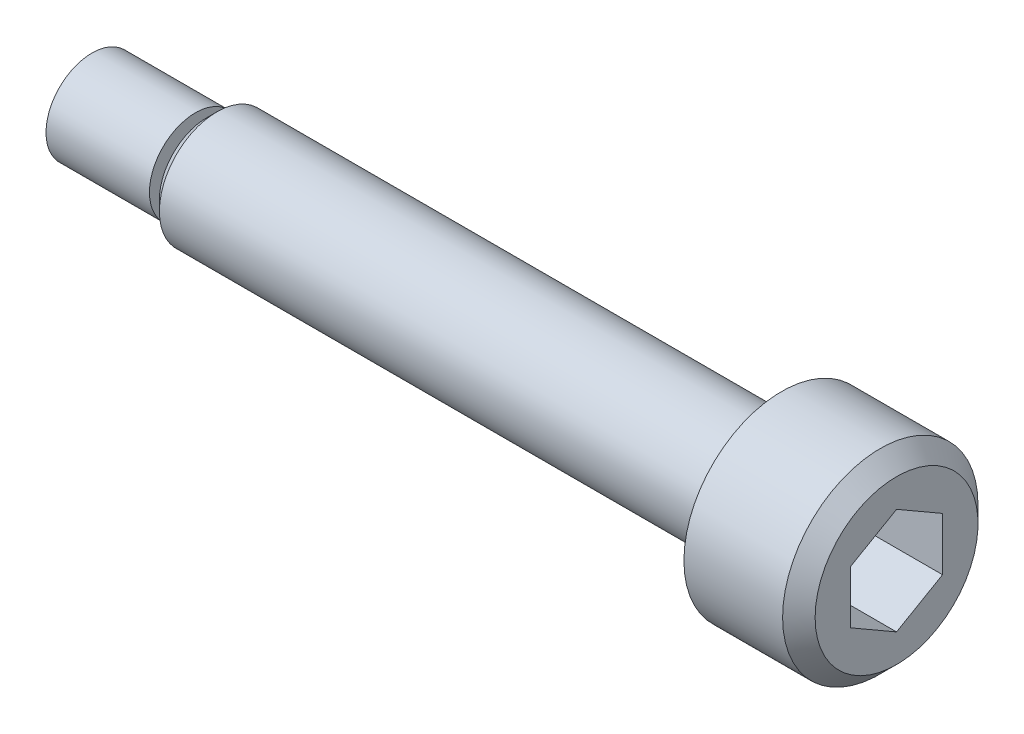
ISO-10303-21;
HEADER;
FILE_DESCRIPTION(('STEP AP214'),'2;1');
FILE_NAME('part.step','',(''),(''),'','','');
FILE_SCHEMA(('AUTOMOTIVE_DESIGN { 1 0 10303 214 1 1 1 1 }'));
ENDSEC;
DATA;
#1=APPLICATION_CONTEXT('core data for automotive mechanical design processes');
#2=APPLICATION_PROTOCOL_DEFINITION('international standard','automotive_design',2000,#1);
#3=PRODUCT_CONTEXT('',#1,'mechanical');
#4=PRODUCT('Part','Part','',(#3));
#5=PRODUCT_RELATED_PRODUCT_CATEGORY('part','',(#4));
#6=PRODUCT_DEFINITION_FORMATION('','',#4);
#7=PRODUCT_DEFINITION_CONTEXT('part definition',#1,'design');
#8=PRODUCT_DEFINITION('design','',#6,#7);
#9=PRODUCT_DEFINITION_SHAPE('','',#8);
#10=(LENGTH_UNIT() NAMED_UNIT(*) SI_UNIT(.MILLI.,.METRE.));
#11=(NAMED_UNIT(*) PLANE_ANGLE_UNIT() SI_UNIT($,.RADIAN.));
#12=(NAMED_UNIT(*) SI_UNIT($,.STERADIAN.) SOLID_ANGLE_UNIT());
#13=UNCERTAINTY_MEASURE_WITH_UNIT(LENGTH_MEASURE(1.E-05),#10,'distance_accuracy_value','');
#14=(GEOMETRIC_REPRESENTATION_CONTEXT(3) GLOBAL_UNCERTAINTY_ASSIGNED_CONTEXT((#13)) GLOBAL_UNIT_ASSIGNED_CONTEXT((#10,
#11,#12)) REPRESENTATION_CONTEXT('',''));
#15=CARTESIAN_POINT('',(0.,0.,0.));
#16=DIRECTION('',(0.,0.,1.));
#17=DIRECTION('',(1.,0.,0.));
#18=AXIS2_PLACEMENT_3D('',#15,#16,#17);
#19=CARTESIAN_POINT('',(30.,3.54289321881345,0.));
#20=DIRECTION('',(-1.,0.,0.));
#21=DIRECTION('',(0.,0.,1.));
#22=AXIS2_PLACEMENT_3D('',#19,#20,#21);
#23=PLANE('',#22);
#24=CARTESIAN_POINT('',(30.,0.,0.));
#25=DIRECTION('',(-1.,0.,0.));
#26=DIRECTION('',(0.,0.,1.));
#27=AXIS2_PLACEMENT_3D('',#24,#25,#26);
#28=CIRCLE('',#27,3.54289321881345);
#29=CARTESIAN_POINT('',(30.,0.,3.54289321881345));
#30=VERTEX_POINT('',#29);
#31=EDGE_CURVE('E177',#30,#30,#28,.T.);
#32=ORIENTED_EDGE('',*,*,#31,.F.);
#33=EDGE_LOOP('',(#32));
#34=FACE_BOUND('',#33,.T.);
#35=DIRECTION('',(0.,-1.,0.));
#36=VECTOR('',#35,1.);
#37=CARTESIAN_POINT('',(30.,1.15470053837925,2.));
#38=LINE('',#37,#36);
#39=CARTESIAN_POINT('',(30.,1.15470053837925,2.));
#40=VERTEX_POINT('',#39);
#41=CARTESIAN_POINT('',(30.,-1.15470053837925,2.));
#42=VERTEX_POINT('',#41);
#43=EDGE_CURVE('E152',#40,#42,#38,.T.);
#44=ORIENTED_EDGE('',*,*,#43,.F.);
#45=DIRECTION('',(0.,-0.5,0.866025403784439));
#46=VECTOR('',#45,1.);
#47=CARTESIAN_POINT('',(30.,2.3094010767585,0.));
#48=LINE('',#47,#46);
#49=CARTESIAN_POINT('',(30.,2.3094010767585,0.));
#50=VERTEX_POINT('',#49);
#51=EDGE_CURVE('E53',#50,#40,#48,.T.);
#52=ORIENTED_EDGE('',*,*,#51,.F.);
#53=DIRECTION('',(0.,0.5,0.866025403784439));
#54=VECTOR('',#53,1.);
#55=CARTESIAN_POINT('',(30.,1.15470053837925,-2.));
#56=LINE('',#55,#54);
#57=CARTESIAN_POINT('',(30.,1.15470053837925,-2.));
#58=VERTEX_POINT('',#57);
#59=EDGE_CURVE('E123',#58,#50,#56,.T.);
#60=ORIENTED_EDGE('',*,*,#59,.F.);
#61=DIRECTION('',(0.,1.,0.));
#62=VECTOR('',#61,1.);
#63=CARTESIAN_POINT('',(30.,-1.15470053837925,-2.));
#64=LINE('',#63,#62);
#65=CARTESIAN_POINT('',(30.,-1.15470053837925,-2.));
#66=VERTEX_POINT('',#65);
#67=EDGE_CURVE('E159',#66,#58,#64,.T.);
#68=ORIENTED_EDGE('',*,*,#67,.F.);
#69=DIRECTION('',(0.,0.5,-0.866025403784439));
#70=VECTOR('',#69,1.);
#71=CARTESIAN_POINT('',(30.,-2.3094010767585,0.));
#72=LINE('',#71,#70);
#73=CARTESIAN_POINT('',(30.,-2.3094010767585,0.));
#74=VERTEX_POINT('',#73);
#75=EDGE_CURVE('E156',#74,#66,#72,.T.);
#76=ORIENTED_EDGE('',*,*,#75,.F.);
#77=DIRECTION('',(0.,-0.5,-0.866025403784439));
#78=VECTOR('',#77,1.);
#79=CARTESIAN_POINT('',(30.,-1.15470053837925,2.));
#80=LINE('',#79,#78);
#81=EDGE_CURVE('E154',#42,#74,#80,.T.);
#82=ORIENTED_EDGE('',*,*,#81,.F.);
#83=EDGE_LOOP('',(#44,#52,#60,#68,#76,#82));
#84=FACE_BOUND('',#83,.T.);
#85=ADVANCED_FACE('F38',(#34,#84),#23,.F.);
#86=CARTESIAN_POINT('',(-5.,0.,0.));
#87=DIRECTION('',(1.,0.,0.));
#88=DIRECTION('',(0.,0.,-1.));
#89=AXIS2_PLACEMENT_3D('',#86,#87,#88);
#90=PLANE('',#89);
#91=CARTESIAN_POINT('',(-5.,0.,0.));
#92=DIRECTION('',(-1.,0.,0.));
#93=DIRECTION('',(0.,0.,1.));
#94=AXIS2_PLACEMENT_3D('',#91,#92,#93);
#95=CIRCLE('',#94,2.);
#96=CARTESIAN_POINT('',(-5.,0.,2.));
#97=VERTEX_POINT('',#96);
#98=EDGE_CURVE('E11',#97,#97,#95,.T.);
#99=ORIENTED_EDGE('',*,*,#98,.T.);
#100=EDGE_LOOP('',(#99));
#101=FACE_BOUND('',#100,.T.);
#102=ADVANCED_FACE('F40',(#101),#90,.F.);
#103=CARTESIAN_POINT('',(30.,0.,0.));
#104=DIRECTION('',(-1.,0.,0.));
#105=DIRECTION('',(0.,0.,1.));
#106=AXIS2_PLACEMENT_3D('',#103,#104,#105);
#107=CYLINDRICAL_SURFACE('',#106,2.);
#108=ORIENTED_EDGE('',*,*,#98,.F.);
#109=EDGE_LOOP('',(#108));
#110=FACE_BOUND('',#109,.T.);
#111=CARTESIAN_POINT('',(-0.5,0.,0.));
#112=DIRECTION('',(-1.,0.,0.));
#113=DIRECTION('',(0.,0.,1.));
#114=AXIS2_PLACEMENT_3D('',#111,#112,#113);
#115=CIRCLE('',#114,2.);
#116=CARTESIAN_POINT('',(-0.5,0.,2.));
#117=VERTEX_POINT('',#116);
#118=EDGE_CURVE('E46',#117,#117,#115,.T.);
#119=ORIENTED_EDGE('',*,*,#118,.T.);
#120=EDGE_LOOP('',(#119));
#121=FACE_BOUND('',#120,.T.);
#122=ADVANCED_FACE('F204',(#110,#121),#107,.T.);
#123=CARTESIAN_POINT('',(-0.5,2.,0.));
#124=DIRECTION('',(-1.,0.,0.));
#125=DIRECTION('',(0.,0.,1.));
#126=AXIS2_PLACEMENT_3D('',#123,#124,#125);
#127=PLANE('',#126);
#128=ORIENTED_EDGE('',*,*,#118,.F.);
#129=EDGE_LOOP('',(#128));
#130=FACE_BOUND('',#129,.T.);
#131=CARTESIAN_POINT('',(-0.5,0.,0.));
#132=DIRECTION('',(-1.,0.,0.));
#133=DIRECTION('',(0.,0.,1.));
#134=AXIS2_PLACEMENT_3D('',#131,#132,#133);
#135=CIRCLE('',#134,1.3);
#136=CARTESIAN_POINT('',(-0.5,0.,1.3));
#137=VERTEX_POINT('',#136);
#138=EDGE_CURVE('E199',#137,#137,#135,.T.);
#139=ORIENTED_EDGE('',*,*,#138,.T.);
#140=EDGE_LOOP('',(#139));
#141=FACE_BOUND('',#140,.T.);
#142=ADVANCED_FACE('F206',(#130,#141),#127,.F.);
#143=CARTESIAN_POINT('',(30.,0.,0.));
#144=DIRECTION('',(-1.,0.,0.));
#145=DIRECTION('',(0.,0.,1.));
#146=AXIS2_PLACEMENT_3D('',#143,#144,#145);
#147=CYLINDRICAL_SURFACE('',#146,1.3);
#148=ORIENTED_EDGE('',*,*,#138,.F.);
#149=EDGE_LOOP('',(#148));
#150=FACE_BOUND('',#149,.T.);
#151=CARTESIAN_POINT('',(0.,0.,0.));
#152=DIRECTION('',(-1.,0.,0.));
#153=DIRECTION('',(0.,0.,1.));
#154=AXIS2_PLACEMENT_3D('',#151,#152,#153);
#155=CIRCLE('',#154,1.3);
#156=CARTESIAN_POINT('',(0.,0.,1.3));
#157=VERTEX_POINT('',#156);
#158=EDGE_CURVE('E196',#157,#157,#155,.T.);
#159=ORIENTED_EDGE('',*,*,#158,.T.);
#160=EDGE_LOOP('',(#159));
#161=FACE_BOUND('',#160,.T.);
#162=ADVANCED_FACE('F209',(#150,#161),#147,.T.);
#163=CARTESIAN_POINT('',(0.,1.3,0.));
#164=DIRECTION('',(1.,0.,0.));
#165=DIRECTION('',(0.,0.,-1.));
#166=AXIS2_PLACEMENT_3D('',#163,#164,#165);
#167=PLANE('',#166);
#168=ORIENTED_EDGE('',*,*,#158,.F.);
#169=EDGE_LOOP('',(#168));
#170=FACE_BOUND('',#169,.T.);
#171=CARTESIAN_POINT('',(0.,0.,0.));
#172=DIRECTION('',(-1.,0.,0.));
#173=DIRECTION('',(0.,0.,1.));
#174=AXIS2_PLACEMENT_3D('',#171,#172,#173);
#175=CIRCLE('',#174,2.067);
#176=CARTESIAN_POINT('',(0.,0.,2.067));
#177=VERTEX_POINT('',#176);
#178=EDGE_CURVE('E193',#177,#177,#175,.T.);
#179=ORIENTED_EDGE('',*,*,#178,.T.);
#180=EDGE_LOOP('',(#179));
#181=FACE_BOUND('',#180,.T.);
#182=ADVANCED_FACE('F215',(#170,#181),#167,.F.);
#183=CARTESIAN_POINT('',(0.432999999999999,0.,0.));
#184=DIRECTION('',(1.,0.,0.));
#185=DIRECTION('',(0.,0.,-1.));
#186=AXIS2_PLACEMENT_3D('',#183,#184,#185);
#187=CONICAL_SURFACE('',#186,2.5,0.785398163397449);
#188=ORIENTED_EDGE('',*,*,#178,.F.);
#189=EDGE_LOOP('',(#188));
#190=FACE_BOUND('',#189,.T.);
#191=CARTESIAN_POINT('',(0.432999999999999,0.,0.));
#192=DIRECTION('',(-1.,0.,0.));
#193=DIRECTION('',(0.,0.,1.));
#194=AXIS2_PLACEMENT_3D('',#191,#192,#193);
#195=CIRCLE('',#194,2.5);
#196=CARTESIAN_POINT('',(0.432999999999999,0.,2.5));
#197=VERTEX_POINT('',#196);
#198=EDGE_CURVE('E190',#197,#197,#195,.T.);
#199=ORIENTED_EDGE('',*,*,#198,.T.);
#200=EDGE_LOOP('',(#199));
#201=FACE_BOUND('',#200,.T.);
#202=ADVANCED_FACE('F221',(#190,#201),#187,.T.);
#203=CARTESIAN_POINT('',(30.,0.,0.));
#204=DIRECTION('',(-1.,0.,0.));
#205=DIRECTION('',(0.,0.,1.));
#206=AXIS2_PLACEMENT_3D('',#203,#204,#205);
#207=CYLINDRICAL_SURFACE('',#206,2.5);
#208=ORIENTED_EDGE('',*,*,#198,.F.);
#209=EDGE_LOOP('',(#208));
#210=FACE_BOUND('',#209,.T.);
#211=CARTESIAN_POINT('',(25.,0.,0.));
#212=DIRECTION('',(-1.,0.,0.));
#213=DIRECTION('',(0.,0.,1.));
#214=AXIS2_PLACEMENT_3D('',#211,#212,#213);
#215=CIRCLE('',#214,2.5);
#216=CARTESIAN_POINT('',(25.,0.,2.5));
#217=VERTEX_POINT('',#216);
#218=EDGE_CURVE('E187',#217,#217,#215,.T.);
#219=ORIENTED_EDGE('',*,*,#218,.T.);
#220=EDGE_LOOP('',(#219));
#221=FACE_BOUND('',#220,.T.);
#222=ADVANCED_FACE('F227',(#210,#221),#207,.T.);
#223=CARTESIAN_POINT('',(25.,2.5,0.));
#224=DIRECTION('',(1.,0.,0.));
#225=DIRECTION('',(0.,0.,-1.));
#226=AXIS2_PLACEMENT_3D('',#223,#224,#225);
#227=PLANE('',#226);
#228=ORIENTED_EDGE('',*,*,#218,.F.);
#229=EDGE_LOOP('',(#228));
#230=FACE_BOUND('',#229,.T.);
#231=CARTESIAN_POINT('',(25.,0.,0.));
#232=DIRECTION('',(-1.,0.,0.));
#233=DIRECTION('',(0.,0.,1.));
#234=AXIS2_PLACEMENT_3D('',#231,#232,#233);
#235=CIRCLE('',#234,4.25);
#236=CARTESIAN_POINT('',(25.,0.,4.25));
#237=VERTEX_POINT('',#236);
#238=EDGE_CURVE('E184',#237,#237,#235,.T.);
#239=ORIENTED_EDGE('',*,*,#238,.T.);
#240=EDGE_LOOP('',(#239));
#241=FACE_BOUND('',#240,.T.);
#242=ADVANCED_FACE('F233',(#230,#241),#227,.F.);
#243=CARTESIAN_POINT('',(30.,0.,0.));
#244=DIRECTION('',(-1.,0.,0.));
#245=DIRECTION('',(0.,0.,1.));
#246=AXIS2_PLACEMENT_3D('',#243,#244,#245);
#247=CYLINDRICAL_SURFACE('',#246,4.25);
#248=ORIENTED_EDGE('',*,*,#238,.F.);
#249=EDGE_LOOP('',(#248));
#250=FACE_BOUND('',#249,.T.);
#251=CARTESIAN_POINT('',(29.2928932188135,0.,0.));
#252=DIRECTION('',(-1.,0.,0.));
#253=DIRECTION('',(0.,0.,1.));
#254=AXIS2_PLACEMENT_3D('',#251,#252,#253);
#255=CIRCLE('',#254,4.25);
#256=CARTESIAN_POINT('',(29.2928932188135,0.,4.25));
#257=VERTEX_POINT('',#256);
#258=EDGE_CURVE('E181',#257,#257,#255,.T.);
#259=ORIENTED_EDGE('',*,*,#258,.T.);
#260=EDGE_LOOP('',(#259));
#261=FACE_BOUND('',#260,.T.);
#262=ADVANCED_FACE('F239',(#250,#261),#247,.T.);
#263=CARTESIAN_POINT('',(30.,0.,0.));
#264=DIRECTION('',(-1.,0.,0.));
#265=DIRECTION('',(0.,0.,1.));
#266=AXIS2_PLACEMENT_3D('',#263,#264,#265);
#267=CONICAL_SURFACE('',#266,3.54289321881345,0.78539816339745);
#268=ORIENTED_EDGE('',*,*,#258,.F.);
#269=EDGE_LOOP('',(#268));
#270=FACE_BOUND('',#269,.T.);
#271=ORIENTED_EDGE('',*,*,#31,.T.);
#272=EDGE_LOOP('',(#271));
#273=FACE_BOUND('',#272,.T.);
#274=ADVANCED_FACE('F245',(#270,#273),#267,.T.);
#275=CARTESIAN_POINT('',(26.,2.3094010767585,0.));
#276=DIRECTION('',(0.,0.866025403784439,0.5));
#277=DIRECTION('',(0.,-0.5,0.866025403784439));
#278=AXIS2_PLACEMENT_3D('',#275,#276,#277);
#279=PLANE('',#278);
#280=ORIENTED_EDGE('',*,*,#51,.T.);
#281=DIRECTION('',(1.,0.,0.));
#282=VECTOR('',#281,1.);
#283=CARTESIAN_POINT('',(26.,1.15470053837925,2.));
#284=LINE('',#283,#282);
#285=CARTESIAN_POINT('',(26.,1.15470053837925,2.));
#286=VERTEX_POINT('',#285);
#287=EDGE_CURVE('E125',#286,#40,#284,.T.);
#288=ORIENTED_EDGE('',*,*,#287,.F.);
#289=DIRECTION('',(0.,-0.5,0.866025403784439));
#290=VECTOR('',#289,1.);
#291=CARTESIAN_POINT('',(26.,2.3094010767585,0.));
#292=LINE('',#291,#290);
#293=CARTESIAN_POINT('',(26.,1.73205080756888,1.));
#294=VERTEX_POINT('',#293);
#295=EDGE_CURVE('E114',#294,#286,#292,.T.);
#296=ORIENTED_EDGE('',*,*,#295,.F.);
#297=CARTESIAN_POINT('',(26.,2.3094010767585,0.));
#298=VERTEX_POINT('',#297);
#299=EDGE_CURVE('E122',#298,#294,#292,.T.);
#300=ORIENTED_EDGE('',*,*,#299,.F.);
#301=DIRECTION('',(1.,0.,0.));
#302=VECTOR('',#301,1.);
#303=CARTESIAN_POINT('',(26.,2.3094010767585,0.));
#304=LINE('',#303,#302);
#305=EDGE_CURVE('E162',#298,#50,#304,.T.);
#306=ORIENTED_EDGE('',*,*,#305,.T.);
#307=EDGE_LOOP('',(#280,#288,#296,#300,#306));
#308=FACE_BOUND('',#307,.T.);
#309=ADVANCED_FACE('F126',(#308),#279,.F.);
#310=CARTESIAN_POINT('',(26.,1.15470053837925,-2.));
#311=DIRECTION('',(0.,0.866025403784439,-0.5));
#312=DIRECTION('',(0.,0.5,0.866025403784439));
#313=AXIS2_PLACEMENT_3D('',#310,#311,#312);
#314=PLANE('',#313);
#315=ORIENTED_EDGE('',*,*,#59,.T.);
#316=ORIENTED_EDGE('',*,*,#305,.F.);
#317=DIRECTION('',(0.,0.5,0.866025403784439));
#318=VECTOR('',#317,1.);
#319=CARTESIAN_POINT('',(26.,1.15470053837925,-2.));
#320=LINE('',#319,#318);
#321=CARTESIAN_POINT('',(26.,1.73205080756888,-1.));
#322=VERTEX_POINT('',#321);
#323=EDGE_CURVE('E148',#322,#298,#320,.T.);
#324=ORIENTED_EDGE('',*,*,#323,.F.);
#325=CARTESIAN_POINT('',(26.,1.15470053837925,-2.));
#326=VERTEX_POINT('',#325);
#327=EDGE_CURVE('E130',#326,#322,#320,.T.);
#328=ORIENTED_EDGE('',*,*,#327,.F.);
#329=DIRECTION('',(1.,0.,0.));
#330=VECTOR('',#329,1.);
#331=CARTESIAN_POINT('',(26.,1.15470053837925,-2.));
#332=LINE('',#331,#330);
#333=EDGE_CURVE('E165',#326,#58,#332,.T.);
#334=ORIENTED_EDGE('',*,*,#333,.T.);
#335=EDGE_LOOP('',(#315,#316,#324,#328,#334));
#336=FACE_BOUND('',#335,.T.);
#337=ADVANCED_FACE('F287',(#336),#314,.F.);
#338=CARTESIAN_POINT('',(26.,-1.15470053837925,-2.));
#339=DIRECTION('',(0.,0.,-1.));
#340=DIRECTION('',(-1.,0.,0.));
#341=AXIS2_PLACEMENT_3D('',#338,#339,#340);
#342=PLANE('',#341);
#343=ORIENTED_EDGE('',*,*,#67,.T.);
#344=ORIENTED_EDGE('',*,*,#333,.F.);
#345=DIRECTION('',(0.,1.,0.));
#346=VECTOR('',#345,1.);
#347=CARTESIAN_POINT('',(26.,-1.15470053837925,-2.));
#348=LINE('',#347,#346);
#349=CARTESIAN_POINT('',(26.,0.,-2.));
#350=VERTEX_POINT('',#349);
#351=EDGE_CURVE('E146',#350,#326,#348,.T.);
#352=ORIENTED_EDGE('',*,*,#351,.F.);
#353=CARTESIAN_POINT('',(26.,-1.15470053837925,-2.));
#354=VERTEX_POINT('',#353);
#355=EDGE_CURVE('E61',#354,#350,#348,.T.);
#356=ORIENTED_EDGE('',*,*,#355,.F.);
#357=DIRECTION('',(1.,0.,0.));
#358=VECTOR('',#357,1.);
#359=CARTESIAN_POINT('',(26.,-1.15470053837925,-2.));
#360=LINE('',#359,#358);
#361=EDGE_CURVE('E168',#354,#66,#360,.T.);
#362=ORIENTED_EDGE('',*,*,#361,.T.);
#363=EDGE_LOOP('',(#343,#344,#352,#356,#362));
#364=FACE_BOUND('',#363,.T.);
#365=ADVANCED_FACE('F291',(#364),#342,.F.);
#366=CARTESIAN_POINT('',(26.,-2.3094010767585,0.));
#367=DIRECTION('',(0.,-0.866025403784439,-0.5));
#368=DIRECTION('',(0.,0.5,-0.866025403784439));
#369=AXIS2_PLACEMENT_3D('',#366,#367,#368);
#370=PLANE('',#369);
#371=ORIENTED_EDGE('',*,*,#75,.T.);
#372=ORIENTED_EDGE('',*,*,#361,.F.);
#373=DIRECTION('',(0.,0.5,-0.866025403784439));
#374=VECTOR('',#373,1.);
#375=CARTESIAN_POINT('',(26.,-2.3094010767585,0.));
#376=LINE('',#375,#374);
#377=CARTESIAN_POINT('',(26.,-1.73205080756888,-1.));
#378=VERTEX_POINT('',#377);
#379=EDGE_CURVE('E142',#378,#354,#376,.T.);
#380=ORIENTED_EDGE('',*,*,#379,.F.);
#381=CARTESIAN_POINT('',(26.,-2.3094010767585,0.));
#382=VERTEX_POINT('',#381);
#383=EDGE_CURVE('E143',#382,#378,#376,.T.);
#384=ORIENTED_EDGE('',*,*,#383,.F.);
#385=DIRECTION('',(1.,0.,0.));
#386=VECTOR('',#385,1.);
#387=CARTESIAN_POINT('',(26.,-2.3094010767585,0.));
#388=LINE('',#387,#386);
#389=EDGE_CURVE('E171',#382,#74,#388,.T.);
#390=ORIENTED_EDGE('',*,*,#389,.T.);
#391=EDGE_LOOP('',(#371,#372,#380,#384,#390));
#392=FACE_BOUND('',#391,.T.);
#393=ADVANCED_FACE('F294',(#392),#370,.F.);
#394=CARTESIAN_POINT('',(26.,-1.15470053837925,2.));
#395=DIRECTION('',(0.,-0.866025403784439,0.5));
#396=DIRECTION('',(0.,-0.5,-0.866025403784439));
#397=AXIS2_PLACEMENT_3D('',#394,#395,#396);
#398=PLANE('',#397);
#399=ORIENTED_EDGE('',*,*,#81,.T.);
#400=ORIENTED_EDGE('',*,*,#389,.F.);
#401=DIRECTION('',(0.,-0.5,-0.866025403784439));
#402=VECTOR('',#401,1.);
#403=CARTESIAN_POINT('',(26.,-1.15470053837925,2.));
#404=LINE('',#403,#402);
#405=CARTESIAN_POINT('',(26.,-1.73205080756888,1.));
#406=VERTEX_POINT('',#405);
#407=EDGE_CURVE('E136',#406,#382,#404,.T.);
#408=ORIENTED_EDGE('',*,*,#407,.F.);
#409=CARTESIAN_POINT('',(26.,-1.15470053837925,2.));
#410=VERTEX_POINT('',#409);
#411=EDGE_CURVE('E138',#410,#406,#404,.T.);
#412=ORIENTED_EDGE('',*,*,#411,.F.);
#413=DIRECTION('',(1.,0.,0.));
#414=VECTOR('',#413,1.);
#415=CARTESIAN_POINT('',(26.,-1.15470053837925,2.));
#416=LINE('',#415,#414);
#417=EDGE_CURVE('E129',#410,#42,#416,.T.);
#418=ORIENTED_EDGE('',*,*,#417,.T.);
#419=EDGE_LOOP('',(#399,#400,#408,#412,#418));
#420=FACE_BOUND('',#419,.T.);
#421=ADVANCED_FACE('F262',(#420),#398,.F.);
#422=CARTESIAN_POINT('',(26.,1.15470053837925,2.));
#423=DIRECTION('',(0.,0.,1.));
#424=DIRECTION('',(1.,0.,0.));
#425=AXIS2_PLACEMENT_3D('',#422,#423,#424);
#426=PLANE('',#425);
#427=ORIENTED_EDGE('',*,*,#43,.T.);
#428=ORIENTED_EDGE('',*,*,#417,.F.);
#429=DIRECTION('',(0.,-1.,0.));
#430=VECTOR('',#429,1.);
#431=CARTESIAN_POINT('',(26.,1.15470053837925,2.));
#432=LINE('',#431,#430);
#433=CARTESIAN_POINT('',(26.,0.,2.));
#434=VERTEX_POINT('',#433);
#435=EDGE_CURVE('E135',#434,#410,#432,.T.);
#436=ORIENTED_EDGE('',*,*,#435,.F.);
#437=EDGE_CURVE('E117',#286,#434,#432,.T.);
#438=ORIENTED_EDGE('',*,*,#437,.F.);
#439=ORIENTED_EDGE('',*,*,#287,.T.);
#440=EDGE_LOOP('',(#427,#428,#436,#438,#439));
#441=FACE_BOUND('',#440,.T.);
#442=ADVANCED_FACE('F133',(#441),#426,.F.);
#443=CARTESIAN_POINT('',(26.,1.15470053837925,2.));
#444=DIRECTION('',(1.,0.,0.));
#445=DIRECTION('',(0.,0.,-1.));
#446=AXIS2_PLACEMENT_3D('',#443,#444,#445);
#447=PLANE('',#446);
#448=ORIENTED_EDGE('',*,*,#351,.T.);
#449=ORIENTED_EDGE('',*,*,#327,.T.);
#450=CARTESIAN_POINT('',(26.,0.,0.));
#451=DIRECTION('',(-1.,0.,0.));
#452=DIRECTION('',(0.,0.,1.));
#453=AXIS2_PLACEMENT_3D('',#450,#451,#452);
#454=CIRCLE('',#453,2.);
#455=EDGE_CURVE('E276',#322,#350,#454,.T.);
#456=ORIENTED_EDGE('',*,*,#455,.T.);
#457=EDGE_LOOP('',(#448,#449,#456));
#458=FACE_BOUND('',#457,.T.);
#459=ADVANCED_FACE('F288',(#458),#447,.T.);
#460=ORIENTED_EDGE('',*,*,#323,.T.);
#461=ORIENTED_EDGE('',*,*,#299,.T.);
#462=EDGE_CURVE('E178',#294,#322,#454,.T.);
#463=ORIENTED_EDGE('',*,*,#462,.T.);
#464=EDGE_LOOP('',(#460,#461,#463));
#465=FACE_BOUND('',#464,.T.);
#466=ADVANCED_FACE('F283',(#465),#447,.T.);
#467=ORIENTED_EDGE('',*,*,#295,.T.);
#468=ORIENTED_EDGE('',*,*,#437,.T.);
#469=EDGE_CURVE('E119',#434,#294,#454,.T.);
#470=ORIENTED_EDGE('',*,*,#469,.T.);
#471=EDGE_LOOP('',(#467,#468,#470));
#472=FACE_BOUND('',#471,.T.);
#473=ADVANCED_FACE('F115',(#472),#447,.T.);
#474=ORIENTED_EDGE('',*,*,#435,.T.);
#475=ORIENTED_EDGE('',*,*,#411,.T.);
#476=EDGE_CURVE('E164',#406,#434,#454,.T.);
#477=ORIENTED_EDGE('',*,*,#476,.T.);
#478=EDGE_LOOP('',(#474,#475,#477));
#479=FACE_BOUND('',#478,.T.);
#480=ADVANCED_FACE('F267',(#479),#447,.T.);
#481=ORIENTED_EDGE('',*,*,#407,.T.);
#482=ORIENTED_EDGE('',*,*,#383,.T.);
#483=EDGE_CURVE('E272',#378,#406,#454,.T.);
#484=ORIENTED_EDGE('',*,*,#483,.T.);
#485=EDGE_LOOP('',(#481,#482,#484));
#486=FACE_BOUND('',#485,.T.);
#487=ADVANCED_FACE('F296',(#486),#447,.T.);
#488=ORIENTED_EDGE('',*,*,#379,.T.);
#489=ORIENTED_EDGE('',*,*,#355,.T.);
#490=EDGE_CURVE('E274',#350,#378,#454,.T.);
#491=ORIENTED_EDGE('',*,*,#490,.T.);
#492=EDGE_LOOP('',(#488,#489,#491));
#493=FACE_BOUND('',#492,.T.);
#494=ADVANCED_FACE('F298',(#493),#447,.T.);
#495=CARTESIAN_POINT('',(26.,0.,0.));
#496=DIRECTION('',(1.,0.,0.));
#497=DIRECTION('',(0.,0.,-1.));
#498=AXIS2_PLACEMENT_3D('',#495,#496,#497);
#499=CONICAL_SURFACE('',#498,2.,1.0471975511966);
#500=CARTESIAN_POINT('',(24.8452994616208,0.,0.));
#501=VERTEX_POINT('',#500);
#502=VERTEX_LOOP('',#501);
#503=FACE_BOUND('',#502,.T.);
#504=ORIENTED_EDGE('',*,*,#469,.F.);
#505=ORIENTED_EDGE('',*,*,#476,.F.);
#506=ORIENTED_EDGE('',*,*,#483,.F.);
#507=ORIENTED_EDGE('',*,*,#490,.F.);
#508=ORIENTED_EDGE('',*,*,#455,.F.);
#509=ORIENTED_EDGE('',*,*,#462,.F.);
#510=EDGE_LOOP('',(#504,#505,#506,#507,#508,#509));
#511=FACE_BOUND('',#510,.T.);
#512=ADVANCED_FACE('F270',(#503,#511),#499,.F.);
#513=CLOSED_SHELL('',(#85,#102,#122,#142,#162,#182,#202,#222,#242,#262,#274,#309,#337,#365,#393,
#421,#442,#459,#466,#473,#480,#487,#494,#512));
#514=MANIFOLD_SOLID_BREP('B2',#513);
#515=ADVANCED_BREP_SHAPE_REPRESENTATION('',(#18,#514),#14);
#516=SHAPE_DEFINITION_REPRESENTATION(#9,#515);
ENDSEC;
END-ISO-10303-21;
